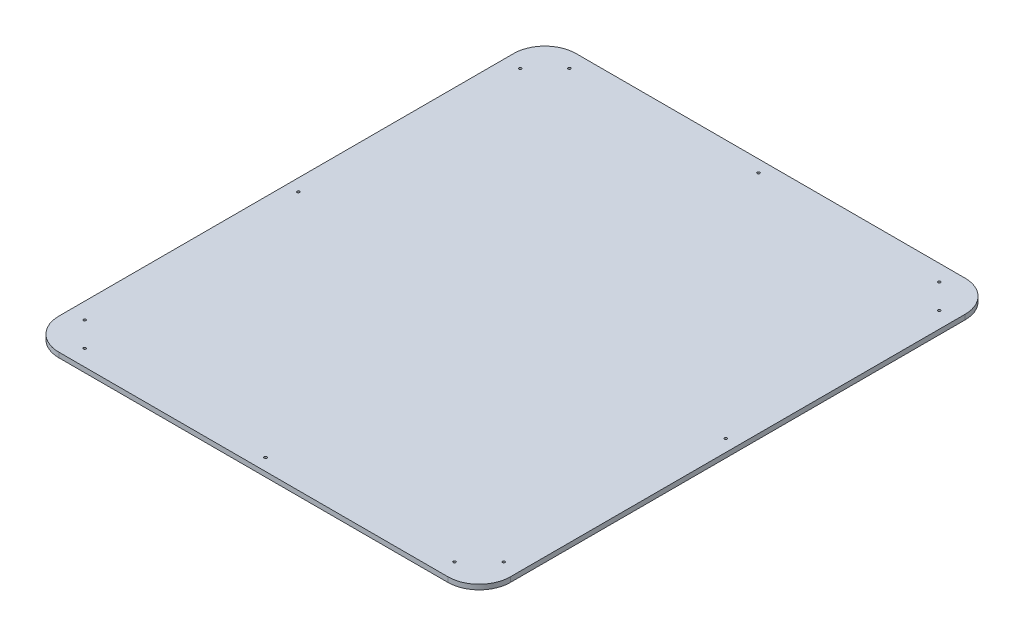
ISO-10303-21;
HEADER;
FILE_DESCRIPTION(('STEP AP214'),'2;1');
FILE_NAME('part.step','',(''),(''),'','','');
FILE_SCHEMA(('AUTOMOTIVE_DESIGN { 1 0 10303 214 1 1 1 1 }'));
ENDSEC;
DATA;
#1=APPLICATION_CONTEXT('core data for automotive mechanical design processes');
#2=APPLICATION_PROTOCOL_DEFINITION('international standard','automotive_design',2000,#1);
#3=PRODUCT_CONTEXT('',#1,'mechanical');
#4=PRODUCT('Part','Part','',(#3));
#5=PRODUCT_RELATED_PRODUCT_CATEGORY('part','',(#4));
#6=PRODUCT_DEFINITION_FORMATION('','',#4);
#7=PRODUCT_DEFINITION_CONTEXT('part definition',#1,'design');
#8=PRODUCT_DEFINITION('design','',#6,#7);
#9=PRODUCT_DEFINITION_SHAPE('','',#8);
#10=(LENGTH_UNIT() NAMED_UNIT(*) SI_UNIT(.MILLI.,.METRE.));
#11=(NAMED_UNIT(*) PLANE_ANGLE_UNIT() SI_UNIT($,.RADIAN.));
#12=(NAMED_UNIT(*) SI_UNIT($,.STERADIAN.) SOLID_ANGLE_UNIT());
#13=UNCERTAINTY_MEASURE_WITH_UNIT(LENGTH_MEASURE(1.E-05),#10,'distance_accuracy_value','');
#14=(GEOMETRIC_REPRESENTATION_CONTEXT(3) GLOBAL_UNCERTAINTY_ASSIGNED_CONTEXT((#13)) GLOBAL_UNIT_ASSIGNED_CONTEXT((#10,
#11,#12)) REPRESENTATION_CONTEXT('',''));
#15=CARTESIAN_POINT('',(0.,0.,0.));
#16=DIRECTION('',(0.,0.,1.));
#17=DIRECTION('',(1.,0.,0.));
#18=AXIS2_PLACEMENT_3D('',#15,#16,#17);
#19=CARTESIAN_POINT('',(0.,6.,0.));
#20=DIRECTION('',(1.,0.,0.));
#21=DIRECTION('',(0.,0.,-1.));
#22=AXIS2_PLACEMENT_3D('',#19,#20,#21);
#23=PLANE('',#22);
#24=DIRECTION('',(0.,0.,1.));
#25=VECTOR('',#24,1.);
#26=CARTESIAN_POINT('',(0.,0.,0.));
#27=LINE('',#26,#25);
#28=CARTESIAN_POINT('',(0.,0.,-592.));
#29=VERTEX_POINT('',#28);
#30=CARTESIAN_POINT('',(0.,0.,-38.));
#31=VERTEX_POINT('',#30);
#32=EDGE_CURVE('E194',#29,#31,#27,.T.);
#33=ORIENTED_EDGE('',*,*,#32,.T.);
#34=DIRECTION('',(0.,-1.,0.));
#35=VECTOR('',#34,1.);
#36=CARTESIAN_POINT('',(0.,6.,-38.));
#37=LINE('',#36,#35);
#38=CARTESIAN_POINT('',(0.,6.,-38.));
#39=VERTEX_POINT('',#38);
#40=EDGE_CURVE('E11',#31,#39,#37,.F.);
#41=ORIENTED_EDGE('',*,*,#40,.T.);
#42=DIRECTION('',(0.,0.,1.));
#43=VECTOR('',#42,1.);
#44=CARTESIAN_POINT('',(0.,6.,0.));
#45=LINE('',#44,#43);
#46=CARTESIAN_POINT('',(0.,6.,-592.));
#47=VERTEX_POINT('',#46);
#48=EDGE_CURVE('E148',#47,#39,#45,.T.);
#49=ORIENTED_EDGE('',*,*,#48,.F.);
#50=DIRECTION('',(0.,-1.,0.));
#51=VECTOR('',#50,1.);
#52=CARTESIAN_POINT('',(0.,6.,-592.));
#53=LINE('',#52,#51);
#54=EDGE_CURVE('E49',#47,#29,#53,.T.);
#55=ORIENTED_EDGE('',*,*,#54,.T.);
#56=EDGE_LOOP('',(#33,#41,#49,#55));
#57=FACE_BOUND('',#56,.T.);
#58=ADVANCED_FACE('F40',(#57),#23,.F.);
#59=CARTESIAN_POINT('',(0.,6.,0.));
#60=DIRECTION('',(0.,0.,-1.));
#61=DIRECTION('',(-1.,0.,0.));
#62=AXIS2_PLACEMENT_3D('',#59,#60,#61);
#63=PLANE('',#62);
#64=DIRECTION('',(1.,0.,0.));
#65=VECTOR('',#64,1.);
#66=CARTESIAN_POINT('',(0.,0.,0.));
#67=LINE('',#66,#65);
#68=CARTESIAN_POINT('',(38.,0.,0.));
#69=VERTEX_POINT('',#68);
#70=CARTESIAN_POINT('',(512.,0.,0.));
#71=VERTEX_POINT('',#70);
#72=EDGE_CURVE('E157',#69,#71,#67,.T.);
#73=ORIENTED_EDGE('',*,*,#72,.T.);
#74=DIRECTION('',(0.,-1.,0.));
#75=VECTOR('',#74,1.);
#76=CARTESIAN_POINT('',(512.,6.,0.));
#77=LINE('',#76,#75);
#78=CARTESIAN_POINT('',(512.,6.,0.));
#79=VERTEX_POINT('',#78);
#80=EDGE_CURVE('E56',#71,#79,#77,.F.);
#81=ORIENTED_EDGE('',*,*,#80,.T.);
#82=DIRECTION('',(1.,0.,0.));
#83=VECTOR('',#82,1.);
#84=CARTESIAN_POINT('',(0.,6.,0.));
#85=LINE('',#84,#83);
#86=CARTESIAN_POINT('',(38.,6.,0.));
#87=VERTEX_POINT('',#86);
#88=EDGE_CURVE('E154',#87,#79,#85,.T.);
#89=ORIENTED_EDGE('',*,*,#88,.F.);
#90=DIRECTION('',(0.,-1.,0.));
#91=VECTOR('',#90,1.);
#92=CARTESIAN_POINT('',(38.,6.,0.));
#93=LINE('',#92,#91);
#94=EDGE_CURVE('E184',#87,#69,#93,.T.);
#95=ORIENTED_EDGE('',*,*,#94,.T.);
#96=EDGE_LOOP('',(#73,#81,#89,#95));
#97=FACE_BOUND('',#96,.T.);
#98=ADVANCED_FACE('F340',(#97),#63,.F.);
#99=CARTESIAN_POINT('',(550.,6.,0.));
#100=DIRECTION('',(-1.,0.,0.));
#101=DIRECTION('',(0.,0.,1.));
#102=AXIS2_PLACEMENT_3D('',#99,#100,#101);
#103=PLANE('',#102);
#104=DIRECTION('',(0.,0.,-1.));
#105=VECTOR('',#104,1.);
#106=CARTESIAN_POINT('',(550.,0.,0.));
#107=LINE('',#106,#105);
#108=CARTESIAN_POINT('',(550.,0.,-38.));
#109=VERTEX_POINT('',#108);
#110=CARTESIAN_POINT('',(550.,0.,-592.));
#111=VERTEX_POINT('',#110);
#112=EDGE_CURVE('E149',#109,#111,#107,.T.);
#113=ORIENTED_EDGE('',*,*,#112,.T.);
#114=DIRECTION('',(0.,-1.,0.));
#115=VECTOR('',#114,1.);
#116=CARTESIAN_POINT('',(550.,6.,-592.));
#117=LINE('',#116,#115);
#118=CARTESIAN_POINT('',(550.,6.,-592.));
#119=VERTEX_POINT('',#118);
#120=EDGE_CURVE('E124',#111,#119,#117,.F.);
#121=ORIENTED_EDGE('',*,*,#120,.T.);
#122=DIRECTION('',(0.,0.,-1.));
#123=VECTOR('',#122,1.);
#124=CARTESIAN_POINT('',(550.,6.,0.));
#125=LINE('',#124,#123);
#126=CARTESIAN_POINT('',(550.,6.,-38.));
#127=VERTEX_POINT('',#126);
#128=EDGE_CURVE('E211',#127,#119,#125,.T.);
#129=ORIENTED_EDGE('',*,*,#128,.F.);
#130=DIRECTION('',(0.,-1.,0.));
#131=VECTOR('',#130,1.);
#132=CARTESIAN_POINT('',(550.,6.,-38.));
#133=LINE('',#132,#131);
#134=EDGE_CURVE('E130',#127,#109,#133,.T.);
#135=ORIENTED_EDGE('',*,*,#134,.T.);
#136=EDGE_LOOP('',(#113,#121,#129,#135));
#137=FACE_BOUND('',#136,.T.);
#138=ADVANCED_FACE('F337',(#137),#103,.F.);
#139=CARTESIAN_POINT('',(0.,6.,-630.));
#140=DIRECTION('',(0.,0.,1.));
#141=DIRECTION('',(1.,0.,0.));
#142=AXIS2_PLACEMENT_3D('',#139,#140,#141);
#143=PLANE('',#142);
#144=DIRECTION('',(-1.,0.,0.));
#145=VECTOR('',#144,1.);
#146=CARTESIAN_POINT('',(0.,6.,-630.));
#147=LINE('',#146,#145);
#148=CARTESIAN_POINT('',(512.,6.,-630.));
#149=VERTEX_POINT('',#148);
#150=CARTESIAN_POINT('',(38.,6.,-630.));
#151=VERTEX_POINT('',#150);
#152=EDGE_CURVE('E140',#149,#151,#147,.T.);
#153=ORIENTED_EDGE('',*,*,#152,.F.);
#154=DIRECTION('',(0.,-1.,0.));
#155=VECTOR('',#154,1.);
#156=CARTESIAN_POINT('',(512.,6.,-630.));
#157=LINE('',#156,#155);
#158=CARTESIAN_POINT('',(512.,0.,-630.));
#159=VERTEX_POINT('',#158);
#160=EDGE_CURVE('E123',#149,#159,#157,.T.);
#161=ORIENTED_EDGE('',*,*,#160,.T.);
#162=DIRECTION('',(-1.,0.,0.));
#163=VECTOR('',#162,1.);
#164=CARTESIAN_POINT('',(0.,0.,-630.));
#165=LINE('',#164,#163);
#166=CARTESIAN_POINT('',(38.,0.,-630.));
#167=VERTEX_POINT('',#166);
#168=EDGE_CURVE('E137',#159,#167,#165,.T.);
#169=ORIENTED_EDGE('',*,*,#168,.T.);
#170=DIRECTION('',(0.,-1.,0.));
#171=VECTOR('',#170,1.);
#172=CARTESIAN_POINT('',(38.,6.,-630.));
#173=LINE('',#172,#171);
#174=EDGE_CURVE('E143',#167,#151,#173,.F.);
#175=ORIENTED_EDGE('',*,*,#174,.T.);
#176=EDGE_LOOP('',(#153,#161,#169,#175));
#177=FACE_BOUND('',#176,.T.);
#178=ADVANCED_FACE('F136',(#177),#143,.F.);
#179=CARTESIAN_POINT('',(0.,6.,0.));
#180=DIRECTION('',(0.,-1.,0.));
#181=DIRECTION('',(0.,0.,-1.));
#182=AXIS2_PLACEMENT_3D('',#179,#180,#181);
#183=PLANE('',#182);
#184=CARTESIAN_POINT('',(275.,6.,-615.25));
#185=DIRECTION('',(0.,1.,0.));
#186=DIRECTION('',(0.,0.,1.));
#187=AXIS2_PLACEMENT_3D('',#184,#185,#186);
#188=CIRCLE('',#187,1.59999999999998);
#189=CARTESIAN_POINT('',(275.,6.,-613.65));
#190=VERTEX_POINT('',#189);
#191=EDGE_CURVE('E295',#190,#190,#188,.T.);
#192=ORIENTED_EDGE('',*,*,#191,.F.);
#193=EDGE_LOOP('',(#192));
#194=FACE_BOUND('',#193,.T.);
#195=CARTESIAN_POINT('',(14.75,6.,-315.));
#196=DIRECTION('',(0.,1.,0.));
#197=DIRECTION('',(0.,0.,1.));
#198=AXIS2_PLACEMENT_3D('',#195,#196,#197);
#199=CIRCLE('',#198,1.59999999999999);
#200=CARTESIAN_POINT('',(14.75,6.,-313.4));
#201=VERTEX_POINT('',#200);
#202=EDGE_CURVE('E287',#201,#201,#199,.T.);
#203=ORIENTED_EDGE('',*,*,#202,.F.);
#204=EDGE_LOOP('',(#203));
#205=FACE_BOUND('',#204,.T.);
#206=CARTESIAN_POINT('',(535.25,6.,-315.));
#207=DIRECTION('',(0.,1.,0.));
#208=DIRECTION('',(0.,0.,1.));
#209=AXIS2_PLACEMENT_3D('',#206,#207,#208);
#210=CIRCLE('',#209,1.60000000000002);
#211=CARTESIAN_POINT('',(535.25,6.,-313.4));
#212=VERTEX_POINT('',#211);
#213=EDGE_CURVE('E278',#212,#212,#210,.T.);
#214=ORIENTED_EDGE('',*,*,#213,.F.);
#215=EDGE_LOOP('',(#214));
#216=FACE_BOUND('',#215,.T.);
#217=CARTESIAN_POINT('',(275.,6.,-14.75));
#218=DIRECTION('',(0.,1.,0.));
#219=DIRECTION('',(0.,0.,1.));
#220=AXIS2_PLACEMENT_3D('',#217,#218,#219);
#221=CIRCLE('',#220,1.59999999999996);
#222=CARTESIAN_POINT('',(275.,6.,-13.15));
#223=VERTEX_POINT('',#222);
#224=EDGE_CURVE('E279',#223,#223,#221,.T.);
#225=ORIENTED_EDGE('',*,*,#224,.F.);
#226=EDGE_LOOP('',(#225));
#227=FACE_BOUND('',#226,.T.);
#228=CARTESIAN_POINT('',(530.25,6.,-49.7500000000001));
#229=DIRECTION('',(0.,1.,0.));
#230=DIRECTION('',(0.,0.,1.));
#231=AXIS2_PLACEMENT_3D('',#228,#229,#230);
#232=CIRCLE('',#231,1.54999999999999);
#233=CARTESIAN_POINT('',(530.25,6.,-48.2000000000001));
#234=VERTEX_POINT('',#233);
#235=EDGE_CURVE('E242',#234,#234,#232,.T.);
#236=ORIENTED_EDGE('',*,*,#235,.F.);
#237=EDGE_LOOP('',(#236));
#238=FACE_BOUND('',#237,.T.);
#239=CARTESIAN_POINT('',(500.25,6.,-610.25));
#240=DIRECTION('',(0.,1.,0.));
#241=DIRECTION('',(0.,0.,1.));
#242=AXIS2_PLACEMENT_3D('',#239,#240,#241);
#243=CIRCLE('',#242,1.54999999999998);
#244=CARTESIAN_POINT('',(500.25,6.,-608.7));
#245=VERTEX_POINT('',#244);
#246=EDGE_CURVE('E234',#245,#245,#243,.T.);
#247=ORIENTED_EDGE('',*,*,#246,.F.);
#248=EDGE_LOOP('',(#247));
#249=FACE_BOUND('',#248,.T.);
#250=CARTESIAN_POINT('',(19.75,6.,-580.25));
#251=DIRECTION('',(0.,1.,0.));
#252=DIRECTION('',(0.,0.,-1.));
#253=AXIS2_PLACEMENT_3D('',#250,#251,#252);
#254=CIRCLE('',#253,1.55);
#255=CARTESIAN_POINT('',(19.75,6.,-581.8));
#256=VERTEX_POINT('',#255);
#257=EDGE_CURVE('E224',#256,#256,#254,.T.);
#258=ORIENTED_EDGE('',*,*,#257,.F.);
#259=EDGE_LOOP('',(#258));
#260=FACE_BOUND('',#259,.T.);
#261=CARTESIAN_POINT('',(19.7500000000001,6.,-49.75));
#262=DIRECTION('',(0.,1.,0.));
#263=DIRECTION('',(0.,0.,-1.));
#264=AXIS2_PLACEMENT_3D('',#261,#262,#263);
#265=CIRCLE('',#264,1.54999999999999);
#266=CARTESIAN_POINT('',(19.7500000000001,6.,-51.3));
#267=VERTEX_POINT('',#266);
#268=EDGE_CURVE('E225',#267,#267,#265,.T.);
#269=ORIENTED_EDGE('',*,*,#268,.F.);
#270=EDGE_LOOP('',(#269));
#271=FACE_BOUND('',#270,.T.);
#272=CARTESIAN_POINT('',(49.75,6.,-19.7499999999999));
#273=DIRECTION('',(0.,1.,0.));
#274=DIRECTION('',(0.,0.,-1.));
#275=AXIS2_PLACEMENT_3D('',#272,#273,#274);
#276=CIRCLE('',#275,1.54999999999999);
#277=CARTESIAN_POINT('',(49.75,6.,-21.2999999999999));
#278=VERTEX_POINT('',#277);
#279=EDGE_CURVE('E269',#278,#278,#276,.T.);
#280=ORIENTED_EDGE('',*,*,#279,.F.);
#281=EDGE_LOOP('',(#280));
#282=FACE_BOUND('',#281,.T.);
#283=CARTESIAN_POINT('',(49.7500000000001,6.,-610.25));
#284=DIRECTION('',(0.,1.,0.));
#285=DIRECTION('',(0.,0.,-1.));
#286=AXIS2_PLACEMENT_3D('',#283,#284,#285);
#287=CIRCLE('',#286,1.55);
#288=CARTESIAN_POINT('',(49.7500000000001,6.,-611.8));
#289=VERTEX_POINT('',#288);
#290=EDGE_CURVE('E257',#289,#289,#287,.T.);
#291=ORIENTED_EDGE('',*,*,#290,.F.);
#292=EDGE_LOOP('',(#291));
#293=FACE_BOUND('',#292,.T.);
#294=CARTESIAN_POINT('',(500.25,6.,-19.7500000000001));
#295=DIRECTION('',(0.,1.,0.));
#296=DIRECTION('',(0.,0.,1.));
#297=AXIS2_PLACEMENT_3D('',#294,#295,#296);
#298=CIRCLE('',#297,1.54999999999999);
#299=CARTESIAN_POINT('',(500.25,6.,-18.2000000000001));
#300=VERTEX_POINT('',#299);
#301=EDGE_CURVE('E256',#300,#300,#298,.T.);
#302=ORIENTED_EDGE('',*,*,#301,.F.);
#303=EDGE_LOOP('',(#302));
#304=FACE_BOUND('',#303,.T.);
#305=CARTESIAN_POINT('',(530.25,6.,-580.25));
#306=DIRECTION('',(0.,1.,0.));
#307=DIRECTION('',(0.,0.,1.));
#308=AXIS2_PLACEMENT_3D('',#305,#306,#307);
#309=CIRCLE('',#308,1.54999999999998);
#310=CARTESIAN_POINT('',(530.25,6.,-578.7));
#311=VERTEX_POINT('',#310);
#312=EDGE_CURVE('E206',#311,#311,#309,.T.);
#313=ORIENTED_EDGE('',*,*,#312,.F.);
#314=EDGE_LOOP('',(#313));
#315=FACE_BOUND('',#314,.T.);
#316=ORIENTED_EDGE('',*,*,#128,.T.);
#317=CARTESIAN_POINT('',(512.,6.,-592.));
#318=DIRECTION('',(0.,-1.,0.));
#319=DIRECTION('',(0.,0.,-1.));
#320=AXIS2_PLACEMENT_3D('',#317,#318,#319);
#321=CIRCLE('',#320,38.);
#322=EDGE_CURVE('E181',#119,#149,#321,.F.);
#323=ORIENTED_EDGE('',*,*,#322,.T.);
#324=ORIENTED_EDGE('',*,*,#152,.T.);
#325=CARTESIAN_POINT('',(38.,6.,-592.));
#326=DIRECTION('',(0.,-1.,0.));
#327=DIRECTION('',(0.,0.,-1.));
#328=AXIS2_PLACEMENT_3D('',#325,#326,#327);
#329=CIRCLE('',#328,38.);
#330=EDGE_CURVE('E174',#151,#47,#329,.F.);
#331=ORIENTED_EDGE('',*,*,#330,.T.);
#332=ORIENTED_EDGE('',*,*,#48,.T.);
#333=CARTESIAN_POINT('',(38.,6.,-38.));
#334=DIRECTION('',(0.,-1.,0.));
#335=DIRECTION('',(0.,0.,-1.));
#336=AXIS2_PLACEMENT_3D('',#333,#334,#335);
#337=CIRCLE('',#336,38.);
#338=EDGE_CURVE('E63',#39,#87,#337,.F.);
#339=ORIENTED_EDGE('',*,*,#338,.T.);
#340=ORIENTED_EDGE('',*,*,#88,.T.);
#341=CARTESIAN_POINT('',(512.,6.,-38.));
#342=DIRECTION('',(0.,-1.,0.));
#343=DIRECTION('',(0.,0.,-1.));
#344=AXIS2_PLACEMENT_3D('',#341,#342,#343);
#345=CIRCLE('',#344,38.);
#346=EDGE_CURVE('E178',#79,#127,#345,.F.);
#347=ORIENTED_EDGE('',*,*,#346,.T.);
#348=EDGE_LOOP('',(#316,#323,#324,#331,#332,#339,#340,#347));
#349=FACE_BOUND('',#348,.T.);
#350=ADVANCED_FACE('F308',(#194,#205,#216,#227,#238,#249,#260,#271,#282,#293,#304,#315,#349),
#183,.F.);
#351=CARTESIAN_POINT('',(0.,0.,0.));
#352=DIRECTION('',(0.,-1.,0.));
#353=DIRECTION('',(0.,0.,-1.));
#354=AXIS2_PLACEMENT_3D('',#351,#352,#353);
#355=PLANE('',#354);
#356=CARTESIAN_POINT('',(275.,0.,-615.25));
#357=DIRECTION('',(0.,-1.,0.));
#358=DIRECTION('',(0.,0.,-1.));
#359=AXIS2_PLACEMENT_3D('',#356,#357,#358);
#360=CIRCLE('',#359,1.59999999999998);
#361=CARTESIAN_POINT('',(275.,0.,-616.85));
#362=VERTEX_POINT('',#361);
#363=EDGE_CURVE('E273',#362,#362,#360,.F.);
#364=ORIENTED_EDGE('',*,*,#363,.T.);
#365=EDGE_LOOP('',(#364));
#366=FACE_BOUND('',#365,.T.);
#367=CARTESIAN_POINT('',(14.75,0.,-315.));
#368=DIRECTION('',(0.,-1.,0.));
#369=DIRECTION('',(0.,0.,-1.));
#370=AXIS2_PLACEMENT_3D('',#367,#368,#369);
#371=CIRCLE('',#370,1.59999999999999);
#372=CARTESIAN_POINT('',(14.75,0.,-316.6));
#373=VERTEX_POINT('',#372);
#374=EDGE_CURVE('E291',#373,#373,#371,.F.);
#375=ORIENTED_EDGE('',*,*,#374,.T.);
#376=EDGE_LOOP('',(#375));
#377=FACE_BOUND('',#376,.T.);
#378=CARTESIAN_POINT('',(535.25,0.,-315.));
#379=DIRECTION('',(0.,-1.,0.));
#380=DIRECTION('',(0.,0.,-1.));
#381=AXIS2_PLACEMENT_3D('',#378,#379,#380);
#382=CIRCLE('',#381,1.60000000000002);
#383=CARTESIAN_POINT('',(535.25,0.,-316.6));
#384=VERTEX_POINT('',#383);
#385=EDGE_CURVE('E283',#384,#384,#382,.F.);
#386=ORIENTED_EDGE('',*,*,#385,.T.);
#387=EDGE_LOOP('',(#386));
#388=FACE_BOUND('',#387,.T.);
#389=CARTESIAN_POINT('',(275.,0.,-14.75));
#390=DIRECTION('',(0.,-1.,0.));
#391=DIRECTION('',(0.,0.,-1.));
#392=AXIS2_PLACEMENT_3D('',#389,#390,#391);
#393=CIRCLE('',#392,1.59999999999996);
#394=CARTESIAN_POINT('',(275.,0.,-16.35));
#395=VERTEX_POINT('',#394);
#396=EDGE_CURVE('E274',#395,#395,#393,.F.);
#397=ORIENTED_EDGE('',*,*,#396,.T.);
#398=EDGE_LOOP('',(#397));
#399=FACE_BOUND('',#398,.T.);
#400=CARTESIAN_POINT('',(530.25,0.,-49.7500000000001));
#401=DIRECTION('',(0.,-1.,0.));
#402=DIRECTION('',(0.,0.,-1.));
#403=AXIS2_PLACEMENT_3D('',#400,#401,#402);
#404=CIRCLE('',#403,1.54999999999999);
#405=CARTESIAN_POINT('',(530.25,0.,-51.3));
#406=VERTEX_POINT('',#405);
#407=EDGE_CURVE('E219',#406,#406,#404,.F.);
#408=ORIENTED_EDGE('',*,*,#407,.T.);
#409=EDGE_LOOP('',(#408));
#410=FACE_BOUND('',#409,.T.);
#411=CARTESIAN_POINT('',(500.25,0.,-610.25));
#412=DIRECTION('',(0.,-1.,0.));
#413=DIRECTION('',(0.,0.,-1.));
#414=AXIS2_PLACEMENT_3D('',#411,#412,#413);
#415=CIRCLE('',#414,1.54999999999998);
#416=CARTESIAN_POINT('',(500.25,0.,-611.8));
#417=VERTEX_POINT('',#416);
#418=EDGE_CURVE('E238',#417,#417,#415,.F.);
#419=ORIENTED_EDGE('',*,*,#418,.T.);
#420=EDGE_LOOP('',(#419));
#421=FACE_BOUND('',#420,.T.);
#422=CARTESIAN_POINT('',(19.75,0.,-580.25));
#423=DIRECTION('',(0.,-1.,0.));
#424=DIRECTION('',(0.,0.,-1.));
#425=AXIS2_PLACEMENT_3D('',#422,#423,#424);
#426=CIRCLE('',#425,1.55);
#427=CARTESIAN_POINT('',(19.75,0.,-581.8));
#428=VERTEX_POINT('',#427);
#429=EDGE_CURVE('E230',#428,#428,#426,.F.);
#430=ORIENTED_EDGE('',*,*,#429,.T.);
#431=EDGE_LOOP('',(#430));
#432=FACE_BOUND('',#431,.T.);
#433=CARTESIAN_POINT('',(19.7500000000001,0.,-49.75));
#434=DIRECTION('',(0.,-1.,0.));
#435=DIRECTION('',(0.,0.,-1.));
#436=AXIS2_PLACEMENT_3D('',#433,#434,#435);
#437=CIRCLE('',#436,1.54999999999999);
#438=CARTESIAN_POINT('',(19.7500000000001,0.,-51.3));
#439=VERTEX_POINT('',#438);
#440=EDGE_CURVE('E220',#439,#439,#437,.F.);
#441=ORIENTED_EDGE('',*,*,#440,.T.);
#442=EDGE_LOOP('',(#441));
#443=FACE_BOUND('',#442,.T.);
#444=CARTESIAN_POINT('',(49.75,0.,-19.7499999999999));
#445=DIRECTION('',(0.,-1.,0.));
#446=DIRECTION('',(0.,0.,-1.));
#447=AXIS2_PLACEMENT_3D('',#444,#445,#446);
#448=CIRCLE('',#447,1.54999999999999);
#449=CARTESIAN_POINT('',(49.75,0.,-21.2999999999999));
#450=VERTEX_POINT('',#449);
#451=EDGE_CURVE('E261',#450,#450,#448,.F.);
#452=ORIENTED_EDGE('',*,*,#451,.T.);
#453=EDGE_LOOP('',(#452));
#454=FACE_BOUND('',#453,.T.);
#455=CARTESIAN_POINT('',(49.7500000000001,0.,-610.25));
#456=DIRECTION('',(0.,-1.,0.));
#457=DIRECTION('',(0.,0.,-1.));
#458=AXIS2_PLACEMENT_3D('',#455,#456,#457);
#459=CIRCLE('',#458,1.55);
#460=CARTESIAN_POINT('',(49.7500000000001,0.,-611.8));
#461=VERTEX_POINT('',#460);
#462=EDGE_CURVE('E252',#461,#461,#459,.F.);
#463=ORIENTED_EDGE('',*,*,#462,.T.);
#464=EDGE_LOOP('',(#463));
#465=FACE_BOUND('',#464,.T.);
#466=CARTESIAN_POINT('',(500.25,0.,-19.7500000000001));
#467=DIRECTION('',(0.,-1.,0.));
#468=DIRECTION('',(0.,0.,-1.));
#469=AXIS2_PLACEMENT_3D('',#466,#467,#468);
#470=CIRCLE('',#469,1.54999999999999);
#471=CARTESIAN_POINT('',(500.25,0.,-21.3000000000001));
#472=VERTEX_POINT('',#471);
#473=EDGE_CURVE('E229',#472,#472,#470,.F.);
#474=ORIENTED_EDGE('',*,*,#473,.T.);
#475=EDGE_LOOP('',(#474));
#476=FACE_BOUND('',#475,.T.);
#477=CARTESIAN_POINT('',(530.25,0.,-580.25));
#478=DIRECTION('',(0.,-1.,0.));
#479=DIRECTION('',(0.,0.,-1.));
#480=AXIS2_PLACEMENT_3D('',#477,#478,#479);
#481=CIRCLE('',#480,1.54999999999998);
#482=CARTESIAN_POINT('',(530.25,0.,-581.8));
#483=VERTEX_POINT('',#482);
#484=EDGE_CURVE('E200',#483,#483,#481,.F.);
#485=ORIENTED_EDGE('',*,*,#484,.T.);
#486=EDGE_LOOP('',(#485));
#487=FACE_BOUND('',#486,.T.);
#488=ORIENTED_EDGE('',*,*,#168,.F.);
#489=CARTESIAN_POINT('',(512.,0.,-592.));
#490=DIRECTION('',(0.,-1.,0.));
#491=DIRECTION('',(0.,0.,-1.));
#492=AXIS2_PLACEMENT_3D('',#489,#490,#491);
#493=CIRCLE('',#492,38.);
#494=EDGE_CURVE('E119',#159,#111,#493,.T.);
#495=ORIENTED_EDGE('',*,*,#494,.T.);
#496=ORIENTED_EDGE('',*,*,#112,.F.);
#497=CARTESIAN_POINT('',(512.,0.,-38.));
#498=DIRECTION('',(0.,-1.,0.));
#499=DIRECTION('',(0.,0.,-1.));
#500=AXIS2_PLACEMENT_3D('',#497,#498,#499);
#501=CIRCLE('',#500,38.);
#502=EDGE_CURVE('E131',#109,#71,#501,.T.);
#503=ORIENTED_EDGE('',*,*,#502,.T.);
#504=ORIENTED_EDGE('',*,*,#72,.F.);
#505=CARTESIAN_POINT('',(38.,0.,-38.));
#506=DIRECTION('',(0.,-1.,0.));
#507=DIRECTION('',(0.,0.,-1.));
#508=AXIS2_PLACEMENT_3D('',#505,#506,#507);
#509=CIRCLE('',#508,38.);
#510=EDGE_CURVE('E164',#69,#31,#509,.T.);
#511=ORIENTED_EDGE('',*,*,#510,.T.);
#512=ORIENTED_EDGE('',*,*,#32,.F.);
#513=CARTESIAN_POINT('',(38.,0.,-592.));
#514=DIRECTION('',(0.,-1.,0.));
#515=DIRECTION('',(0.,0.,-1.));
#516=AXIS2_PLACEMENT_3D('',#513,#514,#515);
#517=CIRCLE('',#516,38.);
#518=EDGE_CURVE('E142',#29,#167,#517,.T.);
#519=ORIENTED_EDGE('',*,*,#518,.T.);
#520=EDGE_LOOP('',(#488,#495,#496,#503,#504,#511,#512,#519));
#521=FACE_BOUND('',#520,.T.);
#522=ADVANCED_FACE('F145',(#366,#377,#388,#399,#410,#421,#432,#443,#454,#465,#476,#487,#521),
#355,.T.);
#523=CARTESIAN_POINT('',(530.25,-4.38406204335668,-580.25));
#524=DIRECTION('',(0.,1.,0.));
#525=DIRECTION('',(0.,0.,1.));
#526=AXIS2_PLACEMENT_3D('',#523,#524,#525);
#527=CYLINDRICAL_SURFACE('',#526,1.54999999999998);
#528=ORIENTED_EDGE('',*,*,#312,.T.);
#529=EDGE_LOOP('',(#528));
#530=FACE_BOUND('',#529,.T.);
#531=ORIENTED_EDGE('',*,*,#484,.F.);
#532=EDGE_LOOP('',(#531));
#533=FACE_BOUND('',#532,.T.);
#534=ADVANCED_FACE('F399',(#530,#533),#527,.F.);
#535=CARTESIAN_POINT('',(500.25,-4.38406204335668,-19.7500000000001));
#536=DIRECTION('',(0.,1.,0.));
#537=DIRECTION('',(0.,0.,1.));
#538=AXIS2_PLACEMENT_3D('',#535,#536,#537);
#539=CYLINDRICAL_SURFACE('',#538,1.54999999999999);
#540=ORIENTED_EDGE('',*,*,#301,.T.);
#541=EDGE_LOOP('',(#540));
#542=FACE_BOUND('',#541,.T.);
#543=ORIENTED_EDGE('',*,*,#473,.F.);
#544=EDGE_LOOP('',(#543));
#545=FACE_BOUND('',#544,.T.);
#546=ADVANCED_FACE('F443',(#542,#545),#539,.F.);
#547=CARTESIAN_POINT('',(49.7500000000001,-4.38406204335668,-610.25));
#548=DIRECTION('',(0.,1.,0.));
#549=DIRECTION('',(0.,0.,1.));
#550=AXIS2_PLACEMENT_3D('',#547,#548,#549);
#551=CYLINDRICAL_SURFACE('',#550,1.55);
#552=ORIENTED_EDGE('',*,*,#290,.T.);
#553=EDGE_LOOP('',(#552));
#554=FACE_BOUND('',#553,.T.);
#555=ORIENTED_EDGE('',*,*,#462,.F.);
#556=EDGE_LOOP('',(#555));
#557=FACE_BOUND('',#556,.T.);
#558=ADVANCED_FACE('F441',(#554,#557),#551,.F.);
#559=CARTESIAN_POINT('',(49.75,-4.38406204335668,-19.7499999999999));
#560=DIRECTION('',(0.,1.,0.));
#561=DIRECTION('',(0.,0.,1.));
#562=AXIS2_PLACEMENT_3D('',#559,#560,#561);
#563=CYLINDRICAL_SURFACE('',#562,1.54999999999999);
#564=ORIENTED_EDGE('',*,*,#279,.T.);
#565=EDGE_LOOP('',(#564));
#566=FACE_BOUND('',#565,.T.);
#567=ORIENTED_EDGE('',*,*,#451,.F.);
#568=EDGE_LOOP('',(#567));
#569=FACE_BOUND('',#568,.T.);
#570=ADVANCED_FACE('F437',(#566,#569),#563,.F.);
#571=CARTESIAN_POINT('',(19.7500000000001,-4.38406204335668,-49.75));
#572=DIRECTION('',(0.,1.,0.));
#573=DIRECTION('',(0.,0.,1.));
#574=AXIS2_PLACEMENT_3D('',#571,#572,#573);
#575=CYLINDRICAL_SURFACE('',#574,1.54999999999999);
#576=ORIENTED_EDGE('',*,*,#268,.T.);
#577=EDGE_LOOP('',(#576));
#578=FACE_BOUND('',#577,.T.);
#579=ORIENTED_EDGE('',*,*,#440,.F.);
#580=EDGE_LOOP('',(#579));
#581=FACE_BOUND('',#580,.T.);
#582=ADVANCED_FACE('F440',(#578,#581),#575,.F.);
#583=CARTESIAN_POINT('',(19.75,-4.38406204335668,-580.25));
#584=DIRECTION('',(0.,1.,0.));
#585=DIRECTION('',(0.,0.,1.));
#586=AXIS2_PLACEMENT_3D('',#583,#584,#585);
#587=CYLINDRICAL_SURFACE('',#586,1.55);
#588=ORIENTED_EDGE('',*,*,#257,.T.);
#589=EDGE_LOOP('',(#588));
#590=FACE_BOUND('',#589,.T.);
#591=ORIENTED_EDGE('',*,*,#429,.F.);
#592=EDGE_LOOP('',(#591));
#593=FACE_BOUND('',#592,.T.);
#594=ADVANCED_FACE('F455',(#590,#593),#587,.F.);
#595=CARTESIAN_POINT('',(500.25,-4.38406204335668,-610.25));
#596=DIRECTION('',(0.,1.,0.));
#597=DIRECTION('',(0.,0.,1.));
#598=AXIS2_PLACEMENT_3D('',#595,#596,#597);
#599=CYLINDRICAL_SURFACE('',#598,1.54999999999998);
#600=ORIENTED_EDGE('',*,*,#246,.T.);
#601=EDGE_LOOP('',(#600));
#602=FACE_BOUND('',#601,.T.);
#603=ORIENTED_EDGE('',*,*,#418,.F.);
#604=EDGE_LOOP('',(#603));
#605=FACE_BOUND('',#604,.T.);
#606=ADVANCED_FACE('F451',(#602,#605),#599,.F.);
#607=CARTESIAN_POINT('',(530.25,-4.38406204335668,-49.7500000000001));
#608=DIRECTION('',(0.,1.,0.));
#609=DIRECTION('',(0.,0.,1.));
#610=AXIS2_PLACEMENT_3D('',#607,#608,#609);
#611=CYLINDRICAL_SURFACE('',#610,1.54999999999999);
#612=ORIENTED_EDGE('',*,*,#235,.T.);
#613=EDGE_LOOP('',(#612));
#614=FACE_BOUND('',#613,.T.);
#615=ORIENTED_EDGE('',*,*,#407,.F.);
#616=EDGE_LOOP('',(#615));
#617=FACE_BOUND('',#616,.T.);
#618=ADVANCED_FACE('F363',(#614,#617),#611,.F.);
#619=CARTESIAN_POINT('',(512.,6.,-592.));
#620=DIRECTION('',(0.,-1.,0.));
#621=DIRECTION('',(0.,0.,-1.));
#622=AXIS2_PLACEMENT_3D('',#619,#620,#621);
#623=CYLINDRICAL_SURFACE('',#622,38.);
#624=ORIENTED_EDGE('',*,*,#322,.F.);
#625=ORIENTED_EDGE('',*,*,#120,.F.);
#626=ORIENTED_EDGE('',*,*,#494,.F.);
#627=ORIENTED_EDGE('',*,*,#160,.F.);
#628=EDGE_LOOP('',(#624,#625,#626,#627));
#629=FACE_BOUND('',#628,.T.);
#630=ADVANCED_FACE('F122',(#629),#623,.T.);
#631=CARTESIAN_POINT('',(512.,6.,-38.));
#632=DIRECTION('',(0.,-1.,0.));
#633=DIRECTION('',(0.,0.,-1.));
#634=AXIS2_PLACEMENT_3D('',#631,#632,#633);
#635=CYLINDRICAL_SURFACE('',#634,38.);
#636=ORIENTED_EDGE('',*,*,#346,.F.);
#637=ORIENTED_EDGE('',*,*,#80,.F.);
#638=ORIENTED_EDGE('',*,*,#502,.F.);
#639=ORIENTED_EDGE('',*,*,#134,.F.);
#640=EDGE_LOOP('',(#636,#637,#638,#639));
#641=FACE_BOUND('',#640,.T.);
#642=ADVANCED_FACE('F339',(#641),#635,.T.);
#643=CARTESIAN_POINT('',(38.,6.,-38.));
#644=DIRECTION('',(0.,-1.,0.));
#645=DIRECTION('',(0.,0.,-1.));
#646=AXIS2_PLACEMENT_3D('',#643,#644,#645);
#647=CYLINDRICAL_SURFACE('',#646,38.);
#648=ORIENTED_EDGE('',*,*,#338,.F.);
#649=ORIENTED_EDGE('',*,*,#40,.F.);
#650=ORIENTED_EDGE('',*,*,#510,.F.);
#651=ORIENTED_EDGE('',*,*,#94,.F.);
#652=EDGE_LOOP('',(#648,#649,#650,#651));
#653=FACE_BOUND('',#652,.T.);
#654=ADVANCED_FACE('F343',(#653),#647,.T.);
#655=CARTESIAN_POINT('',(38.,6.,-592.));
#656=DIRECTION('',(0.,-1.,0.));
#657=DIRECTION('',(0.,0.,-1.));
#658=AXIS2_PLACEMENT_3D('',#655,#656,#657);
#659=CYLINDRICAL_SURFACE('',#658,38.);
#660=ORIENTED_EDGE('',*,*,#330,.F.);
#661=ORIENTED_EDGE('',*,*,#174,.F.);
#662=ORIENTED_EDGE('',*,*,#518,.F.);
#663=ORIENTED_EDGE('',*,*,#54,.F.);
#664=EDGE_LOOP('',(#660,#661,#662,#663));
#665=FACE_BOUND('',#664,.T.);
#666=ADVANCED_FACE('F42',(#665),#659,.T.);
#667=CARTESIAN_POINT('',(275.,-4.52548339959396,-14.75));
#668=DIRECTION('',(0.,1.,0.));
#669=DIRECTION('',(0.,0.,1.));
#670=AXIS2_PLACEMENT_3D('',#667,#668,#669);
#671=CYLINDRICAL_SURFACE('',#670,1.59999999999996);
#672=ORIENTED_EDGE('',*,*,#224,.T.);
#673=EDGE_LOOP('',(#672));
#674=FACE_BOUND('',#673,.T.);
#675=ORIENTED_EDGE('',*,*,#396,.F.);
#676=EDGE_LOOP('',(#675));
#677=FACE_BOUND('',#676,.T.);
#678=ADVANCED_FACE('F345',(#674,#677),#671,.F.);
#679=CARTESIAN_POINT('',(535.25,-4.52548339959396,-315.));
#680=DIRECTION('',(0.,1.,0.));
#681=DIRECTION('',(0.,0.,1.));
#682=AXIS2_PLACEMENT_3D('',#679,#680,#681);
#683=CYLINDRICAL_SURFACE('',#682,1.60000000000002);
#684=ORIENTED_EDGE('',*,*,#213,.T.);
#685=EDGE_LOOP('',(#684));
#686=FACE_BOUND('',#685,.T.);
#687=ORIENTED_EDGE('',*,*,#385,.F.);
#688=EDGE_LOOP('',(#687));
#689=FACE_BOUND('',#688,.T.);
#690=ADVANCED_FACE('F350',(#686,#689),#683,.F.);
#691=CARTESIAN_POINT('',(14.75,-4.52548339959396,-315.));
#692=DIRECTION('',(0.,1.,0.));
#693=DIRECTION('',(0.,0.,1.));
#694=AXIS2_PLACEMENT_3D('',#691,#692,#693);
#695=CYLINDRICAL_SURFACE('',#694,1.59999999999999);
#696=ORIENTED_EDGE('',*,*,#202,.T.);
#697=EDGE_LOOP('',(#696));
#698=FACE_BOUND('',#697,.T.);
#699=ORIENTED_EDGE('',*,*,#374,.F.);
#700=EDGE_LOOP('',(#699));
#701=FACE_BOUND('',#700,.T.);
#702=ADVANCED_FACE('F414',(#698,#701),#695,.F.);
#703=CARTESIAN_POINT('',(275.,-4.52548339959396,-615.25));
#704=DIRECTION('',(0.,1.,0.));
#705=DIRECTION('',(0.,0.,1.));
#706=AXIS2_PLACEMENT_3D('',#703,#704,#705);
#707=CYLINDRICAL_SURFACE('',#706,1.59999999999998);
#708=ORIENTED_EDGE('',*,*,#191,.T.);
#709=EDGE_LOOP('',(#708));
#710=FACE_BOUND('',#709,.T.);
#711=ORIENTED_EDGE('',*,*,#363,.F.);
#712=EDGE_LOOP('',(#711));
#713=FACE_BOUND('',#712,.T.);
#714=ADVANCED_FACE('F305',(#710,#713),#707,.F.);
#715=CLOSED_SHELL('',(#58,#98,#138,#178,#350,#522,#534,#546,#558,#570,#582,#594,#606,#618,#630,
#642,#654,#666,#678,#690,#702,#714));
#716=MANIFOLD_SOLID_BREP('B2',#715);
#717=ADVANCED_BREP_SHAPE_REPRESENTATION('',(#18,#716),#14);
#718=SHAPE_DEFINITION_REPRESENTATION(#9,#717);
ENDSEC;
END-ISO-10303-21;
